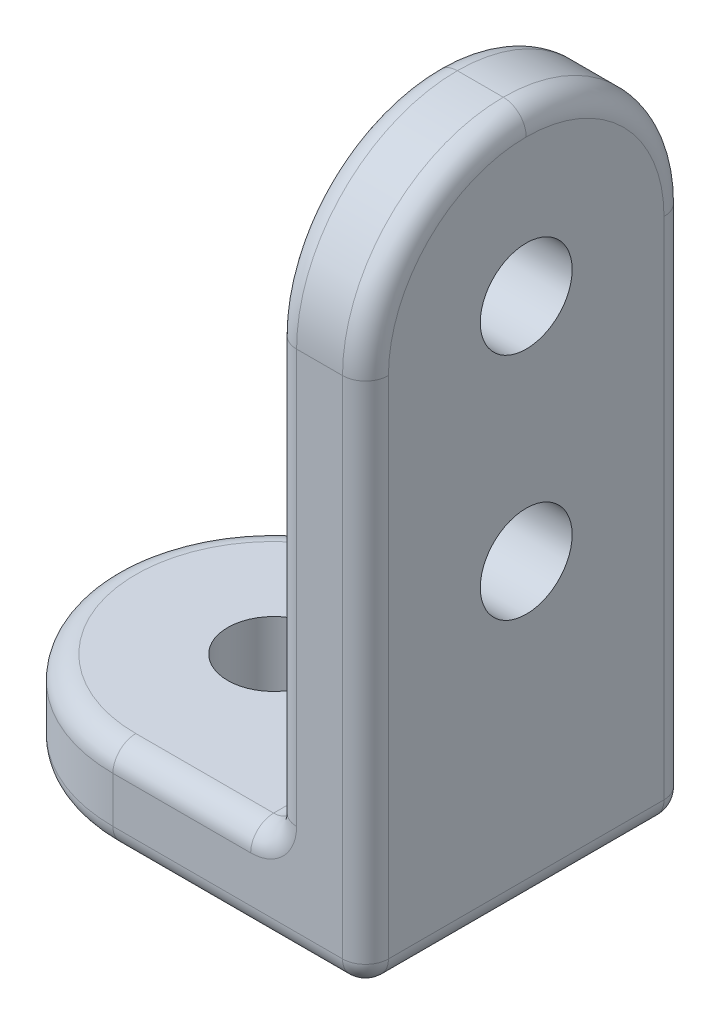
ISO-10303-21;
HEADER;
FILE_DESCRIPTION(('STEP AP214'),'2;1');
FILE_NAME('part.step','',(''),(''),'','','');
FILE_SCHEMA(('AUTOMOTIVE_DESIGN { 1 0 10303 214 1 1 1 1 }'));
ENDSEC;
DATA;
#1=APPLICATION_CONTEXT('core data for automotive mechanical design processes');
#2=APPLICATION_PROTOCOL_DEFINITION('international standard','automotive_design',2000,#1);
#3=PRODUCT_CONTEXT('',#1,'mechanical');
#4=PRODUCT('Part','Part','',(#3));
#5=PRODUCT_RELATED_PRODUCT_CATEGORY('part','',(#4));
#6=PRODUCT_DEFINITION_FORMATION('','',#4);
#7=PRODUCT_DEFINITION_CONTEXT('part definition',#1,'design');
#8=PRODUCT_DEFINITION('design','',#6,#7);
#9=PRODUCT_DEFINITION_SHAPE('','',#8);
#10=(LENGTH_UNIT() NAMED_UNIT(*) SI_UNIT(.MILLI.,.METRE.));
#11=(NAMED_UNIT(*) PLANE_ANGLE_UNIT() SI_UNIT($,.RADIAN.));
#12=(NAMED_UNIT(*) SI_UNIT($,.STERADIAN.) SOLID_ANGLE_UNIT());
#13=UNCERTAINTY_MEASURE_WITH_UNIT(LENGTH_MEASURE(1.E-05),#10,'distance_accuracy_value','');
#14=(GEOMETRIC_REPRESENTATION_CONTEXT(3) GLOBAL_UNCERTAINTY_ASSIGNED_CONTEXT((#13)) GLOBAL_UNIT_ASSIGNED_CONTEXT((#10,
#11,#12)) REPRESENTATION_CONTEXT('',''));
#15=CARTESIAN_POINT('',(0.,0.,0.));
#16=DIRECTION('',(0.,0.,1.));
#17=DIRECTION('',(1.,0.,0.));
#18=AXIS2_PLACEMENT_3D('',#15,#16,#17);
#19=CARTESIAN_POINT('',(0.,4.,0.));
#20=DIRECTION('',(0.,-1.,0.));
#21=DIRECTION('',(0.,0.,-1.));
#22=AXIS2_PLACEMENT_3D('',#19,#20,#21);
#23=CYLINDRICAL_SURFACE('',#22,7.);
#24=DIRECTION('',(0.,-1.,0.));
#25=VECTOR('',#24,1.);
#26=CARTESIAN_POINT('',(0.,4.,7.));
#27=LINE('',#26,#25);
#28=CARTESIAN_POINT('',(0.,3.,7.));
#29=VERTEX_POINT('',#28);
#30=CARTESIAN_POINT('',(0.,1.,7.));
#31=VERTEX_POINT('',#30);
#32=EDGE_CURVE('E346',#29,#31,#27,.T.);
#33=ORIENTED_EDGE('',*,*,#32,.F.);
#34=CARTESIAN_POINT('',(0.,3.,0.));
#35=DIRECTION('',(0.,1.,0.));
#36=DIRECTION('',(0.,0.,1.));
#37=AXIS2_PLACEMENT_3D('',#34,#35,#36);
#38=CIRCLE('',#37,7.);
#39=CARTESIAN_POINT('',(0.,3.,-7.));
#40=VERTEX_POINT('',#39);
#41=EDGE_CURVE('E280',#29,#40,#38,.F.);
#42=ORIENTED_EDGE('',*,*,#41,.T.);
#43=DIRECTION('',(0.,-1.,0.));
#44=VECTOR('',#43,1.);
#45=CARTESIAN_POINT('',(0.,4.,-7.));
#46=LINE('',#45,#44);
#47=CARTESIAN_POINT('',(0.,1.,-7.));
#48=VERTEX_POINT('',#47);
#49=EDGE_CURVE('E383',#40,#48,#46,.T.);
#50=ORIENTED_EDGE('',*,*,#49,.T.);
#51=CARTESIAN_POINT('',(0.,1.,0.));
#52=DIRECTION('',(0.,1.,0.));
#53=DIRECTION('',(0.,0.,1.));
#54=AXIS2_PLACEMENT_3D('',#51,#52,#53);
#55=CIRCLE('',#54,7.);
#56=EDGE_CURVE('E278',#48,#31,#55,.T.);
#57=ORIENTED_EDGE('',*,*,#56,.T.);
#58=EDGE_LOOP('',(#33,#42,#50,#57));
#59=FACE_BOUND('',#58,.T.);
#60=ADVANCED_FACE('F37',(#59),#23,.T.);
#61=CARTESIAN_POINT('',(0.,4.,7.));
#62=DIRECTION('',(0.,0.,1.));
#63=DIRECTION('',(1.,0.,0.));
#64=AXIS2_PLACEMENT_3D('',#61,#62,#63);
#65=PLANE('',#64);
#66=CARTESIAN_POINT('',(6.,5.,7.));
#67=DIRECTION('',(0.,0.,1.));
#68=DIRECTION('',(1.,0.,0.));
#69=AXIS2_PLACEMENT_3D('',#66,#67,#68);
#70=CIRCLE('',#69,2.);
#71=CARTESIAN_POINT('',(8.,5.,7.));
#72=VERTEX_POINT('',#71);
#73=CARTESIAN_POINT('',(6.,3.,7.));
#74=VERTEX_POINT('',#73);
#75=EDGE_CURVE('E46',#72,#74,#70,.F.);
#76=ORIENTED_EDGE('',*,*,#75,.T.);
#77=DIRECTION('',(-1.,0.,0.));
#78=VECTOR('',#77,1.);
#79=CARTESIAN_POINT('',(0.,3.,7.));
#80=LINE('',#79,#78);
#81=EDGE_CURVE('E11',#74,#29,#80,.T.);
#82=ORIENTED_EDGE('',*,*,#81,.T.);
#83=ORIENTED_EDGE('',*,*,#32,.T.);
#84=DIRECTION('',(-1.,0.,0.));
#85=VECTOR('',#84,1.);
#86=CARTESIAN_POINT('',(10.,1.,7.));
#87=LINE('',#86,#85);
#88=CARTESIAN_POINT('',(10.,1.,7.));
#89=VERTEX_POINT('',#88);
#90=EDGE_CURVE('E301',#31,#89,#87,.F.);
#91=ORIENTED_EDGE('',*,*,#90,.T.);
#92=DIRECTION('',(0.,-1.,0.));
#93=VECTOR('',#92,1.);
#94=CARTESIAN_POINT('',(10.,4.,7.));
#95=LINE('',#94,#93);
#96=CARTESIAN_POINT('',(10.,23.,7.));
#97=VERTEX_POINT('',#96);
#98=EDGE_CURVE('E303',#89,#97,#95,.F.);
#99=ORIENTED_EDGE('',*,*,#98,.T.);
#100=DIRECTION('',(1.,0.,0.));
#101=VECTOR('',#100,1.);
#102=CARTESIAN_POINT('',(0.,23.,7.));
#103=LINE('',#102,#101);
#104=CARTESIAN_POINT('',(8.,23.,7.));
#105=VERTEX_POINT('',#104);
#106=EDGE_CURVE('E308',#97,#105,#103,.F.);
#107=ORIENTED_EDGE('',*,*,#106,.T.);
#108=DIRECTION('',(0.,-1.,0.));
#109=VECTOR('',#108,1.);
#110=CARTESIAN_POINT('',(8.,5.00000000000001,7.));
#111=LINE('',#110,#109);
#112=EDGE_CURVE('E57',#105,#72,#111,.T.);
#113=ORIENTED_EDGE('',*,*,#112,.T.);
#114=EDGE_LOOP('',(#76,#82,#83,#91,#99,#107,#113));
#115=FACE_BOUND('',#114,.T.);
#116=ADVANCED_FACE('F307',(#115),#65,.T.);
#117=CARTESIAN_POINT('',(11.,4.,0.));
#118=DIRECTION('',(1.,0.,0.));
#119=DIRECTION('',(0.,0.,-1.));
#120=AXIS2_PLACEMENT_3D('',#117,#118,#119);
#121=PLANE('',#120);
#122=CARTESIAN_POINT('',(11.,23.,0.));
#123=DIRECTION('',(1.,0.,0.));
#124=DIRECTION('',(0.,0.,-1.));
#125=AXIS2_PLACEMENT_3D('',#122,#123,#124);
#126=CIRCLE('',#125,2.);
#127=CARTESIAN_POINT('',(11.,23.,-2.));
#128=VERTEX_POINT('',#127);
#129=EDGE_CURVE('E406',#128,#128,#126,.F.);
#130=ORIENTED_EDGE('',*,*,#129,.T.);
#131=EDGE_LOOP('',(#130));
#132=FACE_BOUND('',#131,.T.);
#133=CARTESIAN_POINT('',(11.,13.,0.));
#134=DIRECTION('',(1.,0.,0.));
#135=DIRECTION('',(0.,0.,-1.));
#136=AXIS2_PLACEMENT_3D('',#133,#134,#135);
#137=CIRCLE('',#136,2.);
#138=CARTESIAN_POINT('',(11.,13.,-2.));
#139=VERTEX_POINT('',#138);
#140=EDGE_CURVE('E399',#139,#139,#137,.F.);
#141=ORIENTED_EDGE('',*,*,#140,.T.);
#142=EDGE_LOOP('',(#141));
#143=FACE_BOUND('',#142,.T.);
#144=DIRECTION('',(0.,0.,1.));
#145=VECTOR('',#144,1.);
#146=CARTESIAN_POINT('',(11.,1.,-7.));
#147=LINE('',#146,#145);
#148=CARTESIAN_POINT('',(11.,1.,6.));
#149=VERTEX_POINT('',#148);
#150=CARTESIAN_POINT('',(11.,1.,-6.));
#151=VERTEX_POINT('',#150);
#152=EDGE_CURVE('E178',#149,#151,#147,.F.);
#153=ORIENTED_EDGE('',*,*,#152,.T.);
#154=DIRECTION('',(0.,-1.,0.));
#155=VECTOR('',#154,1.);
#156=CARTESIAN_POINT('',(11.,4.,-6.));
#157=LINE('',#156,#155);
#158=CARTESIAN_POINT('',(11.,23.,-6.));
#159=VERTEX_POINT('',#158);
#160=EDGE_CURVE('E289',#151,#159,#157,.F.);
#161=ORIENTED_EDGE('',*,*,#160,.T.);
#162=CARTESIAN_POINT('',(11.,23.,0.));
#163=DIRECTION('',(1.,0.,0.));
#164=DIRECTION('',(0.,0.,-1.));
#165=AXIS2_PLACEMENT_3D('',#162,#163,#164);
#166=CIRCLE('',#165,6.);
#167=CARTESIAN_POINT('',(11.,29.,0.));
#168=VERTEX_POINT('',#167);
#169=EDGE_CURVE('E287',#159,#168,#166,.T.);
#170=ORIENTED_EDGE('',*,*,#169,.T.);
#171=CARTESIAN_POINT('',(11.,23.,0.));
#172=DIRECTION('',(1.,0.,0.));
#173=DIRECTION('',(0.,0.,-1.));
#174=AXIS2_PLACEMENT_3D('',#171,#172,#173);
#175=CIRCLE('',#174,6.);
#176=CARTESIAN_POINT('',(11.,23.,6.));
#177=VERTEX_POINT('',#176);
#178=EDGE_CURVE('E284',#168,#177,#175,.T.);
#179=ORIENTED_EDGE('',*,*,#178,.T.);
#180=DIRECTION('',(0.,-1.,0.));
#181=VECTOR('',#180,1.);
#182=CARTESIAN_POINT('',(11.,4.,6.));
#183=LINE('',#182,#181);
#184=EDGE_CURVE('E282',#177,#149,#183,.T.);
#185=ORIENTED_EDGE('',*,*,#184,.T.);
#186=EDGE_LOOP('',(#153,#161,#170,#179,#185));
#187=FACE_BOUND('',#186,.T.);
#188=ADVANCED_FACE('F334',(#132,#143,#187),#121,.T.);
#189=CARTESIAN_POINT('',(0.,4.,0.));
#190=DIRECTION('',(0.,-1.,0.));
#191=DIRECTION('',(0.,0.,-1.));
#192=AXIS2_PLACEMENT_3D('',#189,#190,#191);
#193=CYLINDRICAL_SURFACE('',#192,2.);
#194=CARTESIAN_POINT('',(0.,4.,0.));
#195=DIRECTION('',(0.,1.,0.));
#196=DIRECTION('',(0.,0.,1.));
#197=AXIS2_PLACEMENT_3D('',#194,#195,#196);
#198=CIRCLE('',#197,2.);
#199=CARTESIAN_POINT('',(0.,4.,2.));
#200=VERTEX_POINT('',#199);
#201=EDGE_CURVE('E393',#200,#200,#198,.T.);
#202=ORIENTED_EDGE('',*,*,#201,.T.);
#203=EDGE_LOOP('',(#202));
#204=FACE_BOUND('',#203,.T.);
#205=CARTESIAN_POINT('',(0.,0.,0.));
#206=DIRECTION('',(0.,1.,0.));
#207=DIRECTION('',(0.,0.,1.));
#208=AXIS2_PLACEMENT_3D('',#205,#206,#207);
#209=CIRCLE('',#208,2.);
#210=CARTESIAN_POINT('',(0.,0.,2.));
#211=VERTEX_POINT('',#210);
#212=EDGE_CURVE('E396',#211,#211,#209,.T.);
#213=ORIENTED_EDGE('',*,*,#212,.F.);
#214=EDGE_LOOP('',(#213));
#215=FACE_BOUND('',#214,.T.);
#216=ADVANCED_FACE('F421',(#204,#215),#193,.F.);
#217=CARTESIAN_POINT('',(0.,4.,-7.));
#218=DIRECTION('',(0.,0.,-1.));
#219=DIRECTION('',(-1.,0.,0.));
#220=AXIS2_PLACEMENT_3D('',#217,#218,#219);
#221=PLANE('',#220);
#222=CARTESIAN_POINT('',(6.,5.,-7.));
#223=DIRECTION('',(0.,0.,-1.));
#224=DIRECTION('',(-1.,0.,0.));
#225=AXIS2_PLACEMENT_3D('',#222,#223,#224);
#226=CIRCLE('',#225,2.);
#227=CARTESIAN_POINT('',(6.,3.,-7.));
#228=VERTEX_POINT('',#227);
#229=CARTESIAN_POINT('',(8.,5.,-7.));
#230=VERTEX_POINT('',#229);
#231=EDGE_CURVE('E269',#228,#230,#226,.F.);
#232=ORIENTED_EDGE('',*,*,#231,.T.);
#233=DIRECTION('',(0.,-1.,0.));
#234=VECTOR('',#233,1.);
#235=CARTESIAN_POINT('',(8.,23.,-7.));
#236=LINE('',#235,#234);
#237=CARTESIAN_POINT('',(8.,23.,-7.));
#238=VERTEX_POINT('',#237);
#239=EDGE_CURVE('E192',#230,#238,#236,.F.);
#240=ORIENTED_EDGE('',*,*,#239,.T.);
#241=DIRECTION('',(-1.,0.,0.));
#242=VECTOR('',#241,1.);
#243=CARTESIAN_POINT('',(0.,23.,-7.));
#244=LINE('',#243,#242);
#245=CARTESIAN_POINT('',(10.,23.,-7.));
#246=VERTEX_POINT('',#245);
#247=EDGE_CURVE('E320',#238,#246,#244,.F.);
#248=ORIENTED_EDGE('',*,*,#247,.T.);
#249=DIRECTION('',(0.,-1.,0.));
#250=VECTOR('',#249,1.);
#251=CARTESIAN_POINT('',(10.,4.,-7.));
#252=LINE('',#251,#250);
#253=CARTESIAN_POINT('',(10.,1.,-7.));
#254=VERTEX_POINT('',#253);
#255=EDGE_CURVE('E260',#246,#254,#252,.T.);
#256=ORIENTED_EDGE('',*,*,#255,.T.);
#257=DIRECTION('',(1.,0.,0.));
#258=VECTOR('',#257,1.);
#259=CARTESIAN_POINT('',(0.,1.,-7.));
#260=LINE('',#259,#258);
#261=EDGE_CURVE('E257',#254,#48,#260,.F.);
#262=ORIENTED_EDGE('',*,*,#261,.T.);
#263=ORIENTED_EDGE('',*,*,#49,.F.);
#264=DIRECTION('',(1.,0.,0.));
#265=VECTOR('',#264,1.);
#266=CARTESIAN_POINT('',(0.,3.,-7.));
#267=LINE('',#266,#265);
#268=EDGE_CURVE('E267',#40,#228,#267,.T.);
#269=ORIENTED_EDGE('',*,*,#268,.T.);
#270=EDGE_LOOP('',(#232,#240,#248,#256,#262,#263,#269));
#271=FACE_BOUND('',#270,.T.);
#272=ADVANCED_FACE('F344',(#271),#221,.T.);
#273=CARTESIAN_POINT('',(0.,4.,0.));
#274=DIRECTION('',(0.,1.,0.));
#275=DIRECTION('',(0.,0.,1.));
#276=AXIS2_PLACEMENT_3D('',#273,#274,#275);
#277=PLANE('',#276);
#278=DIRECTION('',(0.,0.,1.));
#279=VECTOR('',#278,1.);
#280=CARTESIAN_POINT('',(6.,4.,0.));
#281=LINE('',#280,#279);
#282=CARTESIAN_POINT('',(6.,4.,6.));
#283=VERTEX_POINT('',#282);
#284=CARTESIAN_POINT('',(6.,4.,-6.));
#285=VERTEX_POINT('',#284);
#286=EDGE_CURVE('E177',#283,#285,#281,.F.);
#287=ORIENTED_EDGE('',*,*,#286,.T.);
#288=DIRECTION('',(1.,0.,0.));
#289=VECTOR('',#288,1.);
#290=CARTESIAN_POINT('',(0.,4.,-6.));
#291=LINE('',#290,#289);
#292=CARTESIAN_POINT('',(0.,4.,-6.));
#293=VERTEX_POINT('',#292);
#294=EDGE_CURVE('E276',#285,#293,#291,.F.);
#295=ORIENTED_EDGE('',*,*,#294,.T.);
#296=CARTESIAN_POINT('',(0.,4.,0.));
#297=DIRECTION('',(0.,1.,0.));
#298=DIRECTION('',(0.,0.,1.));
#299=AXIS2_PLACEMENT_3D('',#296,#297,#298);
#300=CIRCLE('',#299,6.);
#301=CARTESIAN_POINT('',(0.,4.,6.));
#302=VERTEX_POINT('',#301);
#303=EDGE_CURVE('E274',#293,#302,#300,.T.);
#304=ORIENTED_EDGE('',*,*,#303,.T.);
#305=DIRECTION('',(-1.,0.,0.));
#306=VECTOR('',#305,1.);
#307=CARTESIAN_POINT('',(0.,4.,6.));
#308=LINE('',#307,#306);
#309=EDGE_CURVE('E189',#302,#283,#308,.F.);
#310=ORIENTED_EDGE('',*,*,#309,.T.);
#311=EDGE_LOOP('',(#287,#295,#304,#310));
#312=FACE_BOUND('',#311,.T.);
#313=ORIENTED_EDGE('',*,*,#201,.F.);
#314=EDGE_LOOP('',(#313));
#315=FACE_BOUND('',#314,.T.);
#316=ADVANCED_FACE('F429',(#312,#315),#277,.T.);
#317=CARTESIAN_POINT('',(0.,0.,0.));
#318=DIRECTION('',(0.,1.,0.));
#319=DIRECTION('',(0.,0.,1.));
#320=AXIS2_PLACEMENT_3D('',#317,#318,#319);
#321=PLANE('',#320);
#322=ORIENTED_EDGE('',*,*,#212,.T.);
#323=EDGE_LOOP('',(#322));
#324=FACE_BOUND('',#323,.T.);
#325=CARTESIAN_POINT('',(0.,0.,0.));
#326=DIRECTION('',(0.,1.,0.));
#327=DIRECTION('',(0.,0.,1.));
#328=AXIS2_PLACEMENT_3D('',#325,#326,#327);
#329=CIRCLE('',#328,6.);
#330=CARTESIAN_POINT('',(0.,0.,6.));
#331=VERTEX_POINT('',#330);
#332=CARTESIAN_POINT('',(0.,0.,-6.));
#333=VERTEX_POINT('',#332);
#334=EDGE_CURVE('E297',#331,#333,#329,.F.);
#335=ORIENTED_EDGE('',*,*,#334,.T.);
#336=DIRECTION('',(1.,0.,0.));
#337=VECTOR('',#336,1.);
#338=CARTESIAN_POINT('',(10.,0.,-6.));
#339=LINE('',#338,#337);
#340=CARTESIAN_POINT('',(10.,0.,-6.));
#341=VERTEX_POINT('',#340);
#342=EDGE_CURVE('E299',#333,#341,#339,.T.);
#343=ORIENTED_EDGE('',*,*,#342,.T.);
#344=DIRECTION('',(0.,0.,1.));
#345=VECTOR('',#344,1.);
#346=CARTESIAN_POINT('',(10.,0.,7.));
#347=LINE('',#346,#345);
#348=CARTESIAN_POINT('',(10.,0.,6.));
#349=VERTEX_POINT('',#348);
#350=EDGE_CURVE('E319',#341,#349,#347,.T.);
#351=ORIENTED_EDGE('',*,*,#350,.T.);
#352=DIRECTION('',(-1.,0.,0.));
#353=VECTOR('',#352,1.);
#354=CARTESIAN_POINT('',(0.,0.,6.));
#355=LINE('',#354,#353);
#356=EDGE_CURVE('E295',#349,#331,#355,.T.);
#357=ORIENTED_EDGE('',*,*,#356,.T.);
#358=EDGE_LOOP('',(#335,#343,#351,#357));
#359=FACE_BOUND('',#358,.T.);
#360=ADVANCED_FACE('F418',(#324,#359),#321,.F.);
#361=CARTESIAN_POINT('',(7.,30.,7.));
#362=DIRECTION('',(1.,0.,0.));
#363=DIRECTION('',(0.,0.,-1.));
#364=AXIS2_PLACEMENT_3D('',#361,#362,#363);
#365=PLANE('',#364);
#366=CARTESIAN_POINT('',(7.,23.,0.));
#367=DIRECTION('',(-1.,0.,0.));
#368=DIRECTION('',(0.,0.,1.));
#369=AXIS2_PLACEMENT_3D('',#366,#367,#368);
#370=CIRCLE('',#369,2.);
#371=CARTESIAN_POINT('',(7.,23.,2.));
#372=VERTEX_POINT('',#371);
#373=EDGE_CURVE('E411',#372,#372,#370,.T.);
#374=ORIENTED_EDGE('',*,*,#373,.F.);
#375=EDGE_LOOP('',(#374));
#376=FACE_BOUND('',#375,.T.);
#377=CARTESIAN_POINT('',(7.,13.,0.));
#378=DIRECTION('',(-1.,0.,0.));
#379=DIRECTION('',(0.,0.,1.));
#380=AXIS2_PLACEMENT_3D('',#377,#378,#379);
#381=CIRCLE('',#380,2.);
#382=CARTESIAN_POINT('',(7.,13.,2.));
#383=VERTEX_POINT('',#382);
#384=EDGE_CURVE('E401',#383,#383,#381,.T.);
#385=ORIENTED_EDGE('',*,*,#384,.F.);
#386=EDGE_LOOP('',(#385));
#387=FACE_BOUND('',#386,.T.);
#388=CARTESIAN_POINT('',(7.,23.,0.));
#389=DIRECTION('',(1.,0.,0.));
#390=DIRECTION('',(0.,0.,-1.));
#391=AXIS2_PLACEMENT_3D('',#388,#389,#390);
#392=CIRCLE('',#391,6.);
#393=CARTESIAN_POINT('',(7.,29.,0.));
#394=VERTEX_POINT('',#393);
#395=CARTESIAN_POINT('',(7.,23.,-6.));
#396=VERTEX_POINT('',#395);
#397=EDGE_CURVE('E162',#394,#396,#392,.F.);
#398=ORIENTED_EDGE('',*,*,#397,.T.);
#399=DIRECTION('',(0.,-1.,0.));
#400=VECTOR('',#399,1.);
#401=CARTESIAN_POINT('',(7.,5.00000000000001,-6.));
#402=LINE('',#401,#400);
#403=CARTESIAN_POINT('',(7.,5.,-6.));
#404=VERTEX_POINT('',#403);
#405=EDGE_CURVE('E155',#396,#404,#402,.T.);
#406=ORIENTED_EDGE('',*,*,#405,.T.);
#407=DIRECTION('',(0.,0.,1.));
#408=VECTOR('',#407,1.);
#409=CARTESIAN_POINT('',(7.,5.,7.));
#410=LINE('',#409,#408);
#411=CARTESIAN_POINT('',(7.,5.,6.));
#412=VERTEX_POINT('',#411);
#413=EDGE_CURVE('E158',#404,#412,#410,.T.);
#414=ORIENTED_EDGE('',*,*,#413,.T.);
#415=DIRECTION('',(0.,-1.,0.));
#416=VECTOR('',#415,1.);
#417=CARTESIAN_POINT('',(7.,23.,6.));
#418=LINE('',#417,#416);
#419=CARTESIAN_POINT('',(7.,23.,6.));
#420=VERTEX_POINT('',#419);
#421=EDGE_CURVE('E361',#412,#420,#418,.F.);
#422=ORIENTED_EDGE('',*,*,#421,.T.);
#423=CARTESIAN_POINT('',(7.,23.,0.));
#424=DIRECTION('',(1.,0.,0.));
#425=DIRECTION('',(0.,0.,-1.));
#426=AXIS2_PLACEMENT_3D('',#423,#424,#425);
#427=CIRCLE('',#426,6.);
#428=EDGE_CURVE('E363',#420,#394,#427,.F.);
#429=ORIENTED_EDGE('',*,*,#428,.T.);
#430=EDGE_LOOP('',(#398,#406,#414,#422,#429));
#431=FACE_BOUND('',#430,.T.);
#432=ADVANCED_FACE('F157',(#376,#387,#431),#365,.F.);
#433=CARTESIAN_POINT('',(11.001,13.,0.));
#434=DIRECTION('',(-1.,0.,0.));
#435=DIRECTION('',(0.,0.,1.));
#436=AXIS2_PLACEMENT_3D('',#433,#434,#435);
#437=CYLINDRICAL_SURFACE('',#436,2.);
#438=ORIENTED_EDGE('',*,*,#140,.F.);
#439=EDGE_LOOP('',(#438));
#440=FACE_BOUND('',#439,.T.);
#441=ORIENTED_EDGE('',*,*,#384,.T.);
#442=EDGE_LOOP('',(#441));
#443=FACE_BOUND('',#442,.T.);
#444=ADVANCED_FACE('F448',(#440,#443),#437,.F.);
#445=CARTESIAN_POINT('',(11.001,23.,0.));
#446=DIRECTION('',(-1.,0.,0.));
#447=DIRECTION('',(0.,0.,1.));
#448=AXIS2_PLACEMENT_3D('',#445,#446,#447);
#449=CYLINDRICAL_SURFACE('',#448,2.);
#450=ORIENTED_EDGE('',*,*,#129,.F.);
#451=EDGE_LOOP('',(#450));
#452=FACE_BOUND('',#451,.T.);
#453=ORIENTED_EDGE('',*,*,#373,.T.);
#454=EDGE_LOOP('',(#453));
#455=FACE_BOUND('',#454,.T.);
#456=ADVANCED_FACE('F452',(#452,#455),#449,.F.);
#457=CARTESIAN_POINT('',(0.,23.,0.));
#458=DIRECTION('',(1.,0.,0.));
#459=DIRECTION('',(0.,0.,-1.));
#460=AXIS2_PLACEMENT_3D('',#457,#458,#459);
#461=CYLINDRICAL_SURFACE('',#460,7.);
#462=DIRECTION('',(1.,0.,0.));
#463=VECTOR('',#462,1.);
#464=CARTESIAN_POINT('',(0.,30.,0.));
#465=LINE('',#464,#463);
#466=CARTESIAN_POINT('',(8.,30.,0.));
#467=VERTEX_POINT('',#466);
#468=CARTESIAN_POINT('',(10.,30.,0.));
#469=VERTEX_POINT('',#468);
#470=EDGE_CURVE('E210',#467,#469,#465,.T.);
#471=ORIENTED_EDGE('',*,*,#470,.F.);
#472=CARTESIAN_POINT('',(8.,23.,0.));
#473=DIRECTION('',(1.,0.,0.));
#474=DIRECTION('',(0.,0.,-1.));
#475=AXIS2_PLACEMENT_3D('',#472,#473,#474);
#476=CIRCLE('',#475,7.);
#477=EDGE_CURVE('E262',#467,#105,#476,.T.);
#478=ORIENTED_EDGE('',*,*,#477,.T.);
#479=ORIENTED_EDGE('',*,*,#106,.F.);
#480=CARTESIAN_POINT('',(10.,23.,0.));
#481=DIRECTION('',(1.,0.,0.));
#482=DIRECTION('',(0.,0.,-1.));
#483=AXIS2_PLACEMENT_3D('',#480,#481,#482);
#484=CIRCLE('',#483,7.);
#485=EDGE_CURVE('E167',#97,#469,#484,.F.);
#486=ORIENTED_EDGE('',*,*,#485,.T.);
#487=EDGE_LOOP('',(#471,#478,#479,#486));
#488=FACE_BOUND('',#487,.T.);
#489=ADVANCED_FACE('F318',(#488),#461,.T.);
#490=CARTESIAN_POINT('',(0.,23.,0.));
#491=DIRECTION('',(-1.,0.,0.));
#492=DIRECTION('',(0.,0.,1.));
#493=AXIS2_PLACEMENT_3D('',#490,#491,#492);
#494=CYLINDRICAL_SURFACE('',#493,7.);
#495=ORIENTED_EDGE('',*,*,#247,.F.);
#496=CARTESIAN_POINT('',(8.,23.,0.));
#497=DIRECTION('',(1.,0.,0.));
#498=DIRECTION('',(0.,0.,-1.));
#499=AXIS2_PLACEMENT_3D('',#496,#497,#498);
#500=CIRCLE('',#499,7.);
#501=EDGE_CURVE('E252',#238,#467,#500,.T.);
#502=ORIENTED_EDGE('',*,*,#501,.T.);
#503=ORIENTED_EDGE('',*,*,#470,.T.);
#504=CARTESIAN_POINT('',(10.,23.,0.));
#505=DIRECTION('',(1.,0.,0.));
#506=DIRECTION('',(0.,0.,-1.));
#507=AXIS2_PLACEMENT_3D('',#504,#505,#506);
#508=CIRCLE('',#507,7.);
#509=EDGE_CURVE('E258',#469,#246,#508,.F.);
#510=ORIENTED_EDGE('',*,*,#509,.T.);
#511=EDGE_LOOP('',(#495,#502,#503,#510));
#512=FACE_BOUND('',#511,.T.);
#513=ADVANCED_FACE('F341',(#512),#494,.T.);
#514=CARTESIAN_POINT('',(10.,1.,0.));
#515=DIRECTION('',(0.,0.,-1.));
#516=DIRECTION('',(-1.,0.,0.));
#517=AXIS2_PLACEMENT_3D('',#514,#515,#516);
#518=CYLINDRICAL_SURFACE('',#517,1.);
#519=ORIENTED_EDGE('',*,*,#350,.F.);
#520=CARTESIAN_POINT('',(10.,1.,-6.));
#521=DIRECTION('',(0.,0.,-1.));
#522=DIRECTION('',(-1.,0.,0.));
#523=AXIS2_PLACEMENT_3D('',#520,#521,#522);
#524=CIRCLE('',#523,1.);
#525=EDGE_CURVE('E293',#341,#151,#524,.F.);
#526=ORIENTED_EDGE('',*,*,#525,.T.);
#527=ORIENTED_EDGE('',*,*,#152,.F.);
#528=CARTESIAN_POINT('',(10.,1.,6.));
#529=DIRECTION('',(0.,0.,-1.));
#530=DIRECTION('',(-1.,0.,0.));
#531=AXIS2_PLACEMENT_3D('',#528,#529,#530);
#532=CIRCLE('',#531,1.);
#533=EDGE_CURVE('E291',#149,#349,#532,.T.);
#534=ORIENTED_EDGE('',*,*,#533,.T.);
#535=EDGE_LOOP('',(#519,#526,#527,#534));
#536=FACE_BOUND('',#535,.T.);
#537=ADVANCED_FACE('F353',(#536),#518,.T.);
#538=CARTESIAN_POINT('',(6.,5.,7.));
#539=DIRECTION('',(0.,0.,1.));
#540=DIRECTION('',(1.,0.,0.));
#541=AXIS2_PLACEMENT_3D('',#538,#539,#540);
#542=CYLINDRICAL_SURFACE('',#541,1.);
#543=ORIENTED_EDGE('',*,*,#413,.F.);
#544=CARTESIAN_POINT('',(6.,5.,-6.));
#545=DIRECTION('',(0.,0.,-1.));
#546=DIRECTION('',(-1.,0.,0.));
#547=AXIS2_PLACEMENT_3D('',#544,#545,#546);
#548=CIRCLE('',#547,1.);
#549=EDGE_CURVE('E173',#404,#285,#548,.T.);
#550=ORIENTED_EDGE('',*,*,#549,.T.);
#551=ORIENTED_EDGE('',*,*,#286,.F.);
#552=CARTESIAN_POINT('',(6.,5.,6.));
#553=DIRECTION('',(0.,0.,1.));
#554=DIRECTION('',(1.,0.,0.));
#555=AXIS2_PLACEMENT_3D('',#552,#553,#554);
#556=CIRCLE('',#555,1.);
#557=EDGE_CURVE('E176',#283,#412,#556,.T.);
#558=ORIENTED_EDGE('',*,*,#557,.T.);
#559=EDGE_LOOP('',(#543,#550,#551,#558));
#560=FACE_BOUND('',#559,.T.);
#561=ADVANCED_FACE('F171',(#560),#542,.F.);
#562=CARTESIAN_POINT('',(0.,3.,0.));
#563=DIRECTION('',(0.,1.,0.));
#564=DIRECTION('',(0.,0.,1.));
#565=AXIS2_PLACEMENT_3D('',#562,#563,#564);
#566=TOROIDAL_SURFACE('',#565,6.,1.);
#567=CARTESIAN_POINT('',(0.,3.,6.));
#568=DIRECTION('',(1.,0.,0.));
#569=DIRECTION('',(0.,0.,-1.));
#570=AXIS2_PLACEMENT_3D('',#567,#568,#569);
#571=CIRCLE('',#570,1.);
#572=EDGE_CURVE('E204',#302,#29,#571,.T.);
#573=ORIENTED_EDGE('',*,*,#572,.F.);
#574=ORIENTED_EDGE('',*,*,#303,.F.);
#575=CARTESIAN_POINT('',(0.,3.,-6.));
#576=DIRECTION('',(1.,0.,0.));
#577=DIRECTION('',(0.,1.,0.));
#578=AXIS2_PLACEMENT_3D('',#575,#576,#577);
#579=CIRCLE('',#578,1.);
#580=EDGE_CURVE('E207',#40,#293,#579,.T.);
#581=ORIENTED_EDGE('',*,*,#580,.F.);
#582=ORIENTED_EDGE('',*,*,#41,.F.);
#583=EDGE_LOOP('',(#573,#574,#581,#582));
#584=FACE_BOUND('',#583,.T.);
#585=ADVANCED_FACE('F387',(#584),#566,.T.);
#586=CARTESIAN_POINT('',(0.,3.,-6.));
#587=DIRECTION('',(1.,0.,0.));
#588=DIRECTION('',(0.,0.,-1.));
#589=AXIS2_PLACEMENT_3D('',#586,#587,#588);
#590=CYLINDRICAL_SURFACE('',#589,1.);
#591=ORIENTED_EDGE('',*,*,#580,.T.);
#592=ORIENTED_EDGE('',*,*,#294,.F.);
#593=CARTESIAN_POINT('',(6.,3.,-6.));
#594=DIRECTION('',(1.,0.,0.));
#595=DIRECTION('',(0.,0.,-1.));
#596=AXIS2_PLACEMENT_3D('',#593,#594,#595);
#597=CIRCLE('',#596,1.);
#598=EDGE_CURVE('E188',#228,#285,#597,.T.);
#599=ORIENTED_EDGE('',*,*,#598,.F.);
#600=ORIENTED_EDGE('',*,*,#268,.F.);
#601=EDGE_LOOP('',(#591,#592,#599,#600));
#602=FACE_BOUND('',#601,.T.);
#603=ADVANCED_FACE('F392',(#602),#590,.T.);
#604=CARTESIAN_POINT('',(0.,3.,6.));
#605=DIRECTION('',(-1.,0.,0.));
#606=DIRECTION('',(0.,0.,1.));
#607=AXIS2_PLACEMENT_3D('',#604,#605,#606);
#608=CYLINDRICAL_SURFACE('',#607,1.);
#609=ORIENTED_EDGE('',*,*,#572,.T.);
#610=ORIENTED_EDGE('',*,*,#81,.F.);
#611=CARTESIAN_POINT('',(6.,3.,6.));
#612=DIRECTION('',(1.,0.,0.));
#613=DIRECTION('',(0.,0.,-1.));
#614=AXIS2_PLACEMENT_3D('',#611,#612,#613);
#615=CIRCLE('',#614,1.);
#616=EDGE_CURVE('E193',#283,#74,#615,.T.);
#617=ORIENTED_EDGE('',*,*,#616,.F.);
#618=ORIENTED_EDGE('',*,*,#309,.F.);
#619=EDGE_LOOP('',(#609,#610,#617,#618));
#620=FACE_BOUND('',#619,.T.);
#621=ADVANCED_FACE('F375',(#620),#608,.T.);
#622=CARTESIAN_POINT('',(6.,5.,-6.));
#623=DIRECTION('',(0.,0.,-1.));
#624=DIRECTION('',(-1.,0.,0.));
#625=AXIS2_PLACEMENT_3D('',#622,#623,#624);
#626=TOROIDAL_SURFACE('',#625,2.,1.);
#627=ORIENTED_EDGE('',*,*,#598,.T.);
#628=ORIENTED_EDGE('',*,*,#549,.F.);
#629=CARTESIAN_POINT('',(8.,5.,-6.));
#630=DIRECTION('',(0.,1.,0.));
#631=DIRECTION('',(0.,0.,1.));
#632=AXIS2_PLACEMENT_3D('',#629,#630,#631);
#633=CIRCLE('',#632,1.);
#634=EDGE_CURVE('E185',#230,#404,#633,.T.);
#635=ORIENTED_EDGE('',*,*,#634,.F.);
#636=ORIENTED_EDGE('',*,*,#231,.F.);
#637=EDGE_LOOP('',(#627,#628,#635,#636));
#638=FACE_BOUND('',#637,.T.);
#639=ADVANCED_FACE('F183',(#638),#626,.T.);
#640=CARTESIAN_POINT('',(6.,5.,6.));
#641=DIRECTION('',(0.,0.,1.));
#642=DIRECTION('',(1.,0.,0.));
#643=AXIS2_PLACEMENT_3D('',#640,#641,#642);
#644=TOROIDAL_SURFACE('',#643,2.,1.);
#645=ORIENTED_EDGE('',*,*,#616,.T.);
#646=ORIENTED_EDGE('',*,*,#75,.F.);
#647=CARTESIAN_POINT('',(8.,5.,6.));
#648=DIRECTION('',(0.,1.,0.));
#649=DIRECTION('',(0.,0.,1.));
#650=AXIS2_PLACEMENT_3D('',#647,#648,#649);
#651=CIRCLE('',#650,1.);
#652=EDGE_CURVE('E194',#412,#72,#651,.T.);
#653=ORIENTED_EDGE('',*,*,#652,.F.);
#654=ORIENTED_EDGE('',*,*,#557,.F.);
#655=EDGE_LOOP('',(#645,#646,#653,#654));
#656=FACE_BOUND('',#655,.T.);
#657=ADVANCED_FACE('F371',(#656),#644,.T.);
#658=CARTESIAN_POINT('',(8.,30.,-6.));
#659=DIRECTION('',(0.,1.,0.));
#660=DIRECTION('',(0.,0.,1.));
#661=AXIS2_PLACEMENT_3D('',#658,#659,#660);
#662=CYLINDRICAL_SURFACE('',#661,1.);
#663=ORIENTED_EDGE('',*,*,#634,.T.);
#664=ORIENTED_EDGE('',*,*,#405,.F.);
#665=CARTESIAN_POINT('',(8.,23.,-6.));
#666=DIRECTION('',(0.,1.,0.));
#667=DIRECTION('',(0.,0.,1.));
#668=AXIS2_PLACEMENT_3D('',#665,#666,#667);
#669=CIRCLE('',#668,1.);
#670=EDGE_CURVE('E199',#238,#396,#669,.T.);
#671=ORIENTED_EDGE('',*,*,#670,.F.);
#672=ORIENTED_EDGE('',*,*,#239,.F.);
#673=EDGE_LOOP('',(#663,#664,#671,#672));
#674=FACE_BOUND('',#673,.T.);
#675=ADVANCED_FACE('F191',(#674),#662,.T.);
#676=CARTESIAN_POINT('',(8.,4.,6.));
#677=DIRECTION('',(0.,1.,0.));
#678=DIRECTION('',(0.,0.,1.));
#679=AXIS2_PLACEMENT_3D('',#676,#677,#678);
#680=CYLINDRICAL_SURFACE('',#679,1.);
#681=ORIENTED_EDGE('',*,*,#652,.T.);
#682=ORIENTED_EDGE('',*,*,#112,.F.);
#683=CARTESIAN_POINT('',(8.,23.,6.));
#684=DIRECTION('',(0.,1.,0.));
#685=DIRECTION('',(0.,0.,1.));
#686=AXIS2_PLACEMENT_3D('',#683,#684,#685);
#687=CIRCLE('',#686,1.);
#688=EDGE_CURVE('E241',#420,#105,#687,.T.);
#689=ORIENTED_EDGE('',*,*,#688,.F.);
#690=ORIENTED_EDGE('',*,*,#421,.F.);
#691=EDGE_LOOP('',(#681,#682,#689,#690));
#692=FACE_BOUND('',#691,.T.);
#693=ADVANCED_FACE('F369',(#692),#680,.T.);
#694=CARTESIAN_POINT('',(8.,23.,0.));
#695=DIRECTION('',(1.,0.,0.));
#696=DIRECTION('',(0.,0.,-1.));
#697=AXIS2_PLACEMENT_3D('',#694,#695,#696);
#698=TOROIDAL_SURFACE('',#697,6.,1.);
#699=ORIENTED_EDGE('',*,*,#670,.T.);
#700=ORIENTED_EDGE('',*,*,#397,.F.);
#701=CARTESIAN_POINT('',(8.,29.,0.));
#702=DIRECTION('',(0.,0.,1.));
#703=DIRECTION('',(1.,0.,0.));
#704=AXIS2_PLACEMENT_3D('',#701,#702,#703);
#705=CIRCLE('',#704,1.);
#706=EDGE_CURVE('E236',#467,#394,#705,.T.);
#707=ORIENTED_EDGE('',*,*,#706,.F.);
#708=ORIENTED_EDGE('',*,*,#501,.F.);
#709=EDGE_LOOP('',(#699,#700,#707,#708));
#710=FACE_BOUND('',#709,.T.);
#711=ADVANCED_FACE('F251',(#710),#698,.T.);
#712=CARTESIAN_POINT('',(8.,23.,0.));
#713=DIRECTION('',(1.,0.,0.));
#714=DIRECTION('',(0.,0.,-1.));
#715=AXIS2_PLACEMENT_3D('',#712,#713,#714);
#716=TOROIDAL_SURFACE('',#715,6.,1.);
#717=ORIENTED_EDGE('',*,*,#688,.T.);
#718=ORIENTED_EDGE('',*,*,#477,.F.);
#719=ORIENTED_EDGE('',*,*,#706,.T.);
#720=ORIENTED_EDGE('',*,*,#428,.F.);
#721=EDGE_LOOP('',(#717,#718,#719,#720));
#722=FACE_BOUND('',#721,.T.);
#723=ADVANCED_FACE('F367',(#722),#716,.T.);
#724=CARTESIAN_POINT('',(0.,1.,-6.));
#725=DIRECTION('',(-1.,0.,0.));
#726=DIRECTION('',(0.,0.,1.));
#727=AXIS2_PLACEMENT_3D('',#724,#725,#726);
#728=CYLINDRICAL_SURFACE('',#727,1.);
#729=CARTESIAN_POINT('',(10.,1.,-6.));
#730=DIRECTION('',(1.,0.,0.));
#731=DIRECTION('',(0.,0.,-1.));
#732=AXIS2_PLACEMENT_3D('',#729,#730,#731);
#733=CIRCLE('',#732,1.);
#734=EDGE_CURVE('E229',#341,#254,#733,.T.);
#735=ORIENTED_EDGE('',*,*,#734,.F.);
#736=ORIENTED_EDGE('',*,*,#342,.F.);
#737=CARTESIAN_POINT('',(0.,1.,-6.));
#738=DIRECTION('',(-1.,0.,0.));
#739=DIRECTION('',(0.,0.,1.));
#740=AXIS2_PLACEMENT_3D('',#737,#738,#739);
#741=CIRCLE('',#740,1.);
#742=EDGE_CURVE('E41',#48,#333,#741,.T.);
#743=ORIENTED_EDGE('',*,*,#742,.F.);
#744=ORIENTED_EDGE('',*,*,#261,.F.);
#745=EDGE_LOOP('',(#735,#736,#743,#744));
#746=FACE_BOUND('',#745,.T.);
#747=ADVANCED_FACE('F39',(#746),#728,.T.);
#748=CARTESIAN_POINT('',(0.,1.,0.));
#749=DIRECTION('',(0.,1.,0.));
#750=DIRECTION('',(0.,0.,1.));
#751=AXIS2_PLACEMENT_3D('',#748,#749,#750);
#752=TOROIDAL_SURFACE('',#751,6.,1.);
#753=ORIENTED_EDGE('',*,*,#742,.T.);
#754=ORIENTED_EDGE('',*,*,#334,.F.);
#755=CARTESIAN_POINT('',(0.,1.,6.));
#756=DIRECTION('',(1.,0.,0.));
#757=DIRECTION('',(0.,0.,-1.));
#758=AXIS2_PLACEMENT_3D('',#755,#756,#757);
#759=CIRCLE('',#758,1.);
#760=EDGE_CURVE('E227',#31,#331,#759,.T.);
#761=ORIENTED_EDGE('',*,*,#760,.F.);
#762=ORIENTED_EDGE('',*,*,#56,.F.);
#763=EDGE_LOOP('',(#753,#754,#761,#762));
#764=FACE_BOUND('',#763,.T.);
#765=ADVANCED_FACE('F504',(#764),#752,.T.);
#766=CARTESIAN_POINT('',(10.,1.,-6.));
#767=DIRECTION('',(0.,0.,-1.));
#768=DIRECTION('',(-1.,0.,0.));
#769=AXIS2_PLACEMENT_3D('',#766,#767,#768);
#770=SPHERICAL_SURFACE('',#769,1.);
#771=ORIENTED_EDGE('',*,*,#525,.F.);
#772=ORIENTED_EDGE('',*,*,#734,.T.);
#773=CARTESIAN_POINT('',(10.,1.,-6.));
#774=DIRECTION('',(0.,1.,0.));
#775=DIRECTION('',(0.,0.,1.));
#776=AXIS2_PLACEMENT_3D('',#773,#774,#775);
#777=CIRCLE('',#776,1.);
#778=EDGE_CURVE('E224',#151,#254,#777,.T.);
#779=ORIENTED_EDGE('',*,*,#778,.F.);
#780=EDGE_LOOP('',(#771,#772,#779));
#781=FACE_BOUND('',#780,.T.);
#782=ADVANCED_FACE('F350',(#781),#770,.T.);
#783=CARTESIAN_POINT('',(0.,1.,6.));
#784=DIRECTION('',(1.,0.,0.));
#785=DIRECTION('',(0.,0.,-1.));
#786=AXIS2_PLACEMENT_3D('',#783,#784,#785);
#787=CYLINDRICAL_SURFACE('',#786,1.);
#788=ORIENTED_EDGE('',*,*,#760,.T.);
#789=ORIENTED_EDGE('',*,*,#356,.F.);
#790=CARTESIAN_POINT('',(10.,1.,6.));
#791=DIRECTION('',(1.,0.,0.));
#792=DIRECTION('',(0.,0.,-1.));
#793=AXIS2_PLACEMENT_3D('',#790,#791,#792);
#794=CIRCLE('',#793,1.);
#795=EDGE_CURVE('E221',#89,#349,#794,.T.);
#796=ORIENTED_EDGE('',*,*,#795,.F.);
#797=ORIENTED_EDGE('',*,*,#90,.F.);
#798=EDGE_LOOP('',(#788,#789,#796,#797));
#799=FACE_BOUND('',#798,.T.);
#800=ADVANCED_FACE('F499',(#799),#787,.T.);
#801=CARTESIAN_POINT('',(10.,4.,-6.));
#802=DIRECTION('',(0.,-1.,0.));
#803=DIRECTION('',(0.,0.,-1.));
#804=AXIS2_PLACEMENT_3D('',#801,#802,#803);
#805=CYLINDRICAL_SURFACE('',#804,1.);
#806=ORIENTED_EDGE('',*,*,#778,.T.);
#807=ORIENTED_EDGE('',*,*,#255,.F.);
#808=CARTESIAN_POINT('',(10.,23.,-6.));
#809=DIRECTION('',(0.,1.,0.));
#810=DIRECTION('',(0.,0.,1.));
#811=AXIS2_PLACEMENT_3D('',#808,#809,#810);
#812=CIRCLE('',#811,1.);
#813=EDGE_CURVE('E218',#159,#246,#812,.T.);
#814=ORIENTED_EDGE('',*,*,#813,.F.);
#815=ORIENTED_EDGE('',*,*,#160,.F.);
#816=EDGE_LOOP('',(#806,#807,#814,#815));
#817=FACE_BOUND('',#816,.T.);
#818=ADVANCED_FACE('F349',(#817),#805,.T.);
#819=CARTESIAN_POINT('',(10.,1.,6.));
#820=DIRECTION('',(0.,0.,1.));
#821=DIRECTION('',(1.,0.,0.));
#822=AXIS2_PLACEMENT_3D('',#819,#820,#821);
#823=SPHERICAL_SURFACE('',#822,1.);
#824=ORIENTED_EDGE('',*,*,#795,.T.);
#825=ORIENTED_EDGE('',*,*,#533,.F.);
#826=CARTESIAN_POINT('',(10.,1.,6.));
#827=DIRECTION('',(0.,1.,0.));
#828=DIRECTION('',(0.,0.,1.));
#829=AXIS2_PLACEMENT_3D('',#826,#827,#828);
#830=CIRCLE('',#829,1.);
#831=EDGE_CURVE('E215',#89,#149,#830,.T.);
#832=ORIENTED_EDGE('',*,*,#831,.F.);
#833=EDGE_LOOP('',(#824,#825,#832));
#834=FACE_BOUND('',#833,.T.);
#835=ADVANCED_FACE('F493',(#834),#823,.T.);
#836=CARTESIAN_POINT('',(10.,23.,0.));
#837=DIRECTION('',(1.,0.,0.));
#838=DIRECTION('',(0.,0.,-1.));
#839=AXIS2_PLACEMENT_3D('',#836,#837,#838);
#840=TOROIDAL_SURFACE('',#839,6.,1.);
#841=ORIENTED_EDGE('',*,*,#813,.T.);
#842=ORIENTED_EDGE('',*,*,#509,.F.);
#843=CARTESIAN_POINT('',(10.,29.,0.));
#844=DIRECTION('',(0.,0.,1.));
#845=DIRECTION('',(1.,0.,0.));
#846=AXIS2_PLACEMENT_3D('',#843,#844,#845);
#847=CIRCLE('',#846,1.);
#848=EDGE_CURVE('E213',#168,#469,#847,.T.);
#849=ORIENTED_EDGE('',*,*,#848,.F.);
#850=ORIENTED_EDGE('',*,*,#169,.F.);
#851=EDGE_LOOP('',(#841,#842,#849,#850));
#852=FACE_BOUND('',#851,.T.);
#853=ADVANCED_FACE('F339',(#852),#840,.T.);
#854=CARTESIAN_POINT('',(10.,4.,6.));
#855=DIRECTION('',(0.,-1.,0.));
#856=DIRECTION('',(0.,0.,-1.));
#857=AXIS2_PLACEMENT_3D('',#854,#855,#856);
#858=CYLINDRICAL_SURFACE('',#857,1.);
#859=ORIENTED_EDGE('',*,*,#831,.T.);
#860=ORIENTED_EDGE('',*,*,#184,.F.);
#861=CARTESIAN_POINT('',(10.,23.,6.));
#862=DIRECTION('',(0.,1.,0.));
#863=DIRECTION('',(0.,0.,1.));
#864=AXIS2_PLACEMENT_3D('',#861,#862,#863);
#865=CIRCLE('',#864,1.);
#866=EDGE_CURVE('E211',#97,#177,#865,.T.);
#867=ORIENTED_EDGE('',*,*,#866,.F.);
#868=ORIENTED_EDGE('',*,*,#98,.F.);
#869=EDGE_LOOP('',(#859,#860,#867,#868));
#870=FACE_BOUND('',#869,.T.);
#871=ADVANCED_FACE('F329',(#870),#858,.T.);
#872=CARTESIAN_POINT('',(10.,23.,0.));
#873=DIRECTION('',(1.,0.,0.));
#874=DIRECTION('',(0.,0.,-1.));
#875=AXIS2_PLACEMENT_3D('',#872,#873,#874);
#876=TOROIDAL_SURFACE('',#875,6.,1.);
#877=ORIENTED_EDGE('',*,*,#848,.T.);
#878=ORIENTED_EDGE('',*,*,#485,.F.);
#879=ORIENTED_EDGE('',*,*,#866,.T.);
#880=ORIENTED_EDGE('',*,*,#178,.F.);
#881=EDGE_LOOP('',(#877,#878,#879,#880));
#882=FACE_BOUND('',#881,.T.);
#883=ADVANCED_FACE('F323',(#882),#876,.T.);
#884=CLOSED_SHELL('',(#60,#116,#188,#216,#272,#316,#360,#432,#444,#456,#489,#513,#537,#561,#585,
#603,#621,#639,#657,#675,#693,#711,#723,#747,#765,#782,#800,#818,#835,#853,#871,#883));
#885=MANIFOLD_SOLID_BREP('B2',#884);
#886=ADVANCED_BREP_SHAPE_REPRESENTATION('',(#18,#885),#14);
#887=SHAPE_DEFINITION_REPRESENTATION(#9,#886);
ENDSEC;
END-ISO-10303-21;
